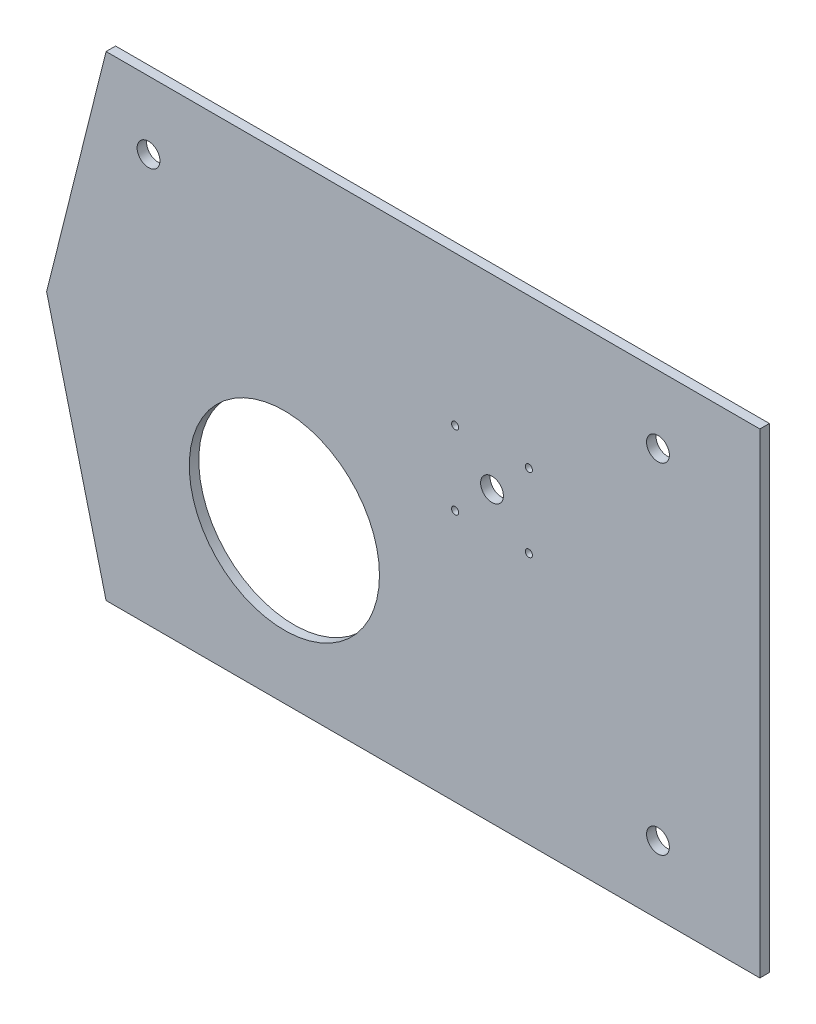
ISO-10303-21;
HEADER;
FILE_DESCRIPTION(('STEP AP214'),'2;1');
FILE_NAME('part.step','',(''),(''),'','','');
FILE_SCHEMA(('AUTOMOTIVE_DESIGN { 1 0 10303 214 1 1 1 1 }'));
ENDSEC;
DATA;
#1=APPLICATION_CONTEXT('core data for automotive mechanical design processes');
#2=APPLICATION_PROTOCOL_DEFINITION('international standard','automotive_design',2000,#1);
#3=PRODUCT_CONTEXT('',#1,'mechanical');
#4=PRODUCT('Part','Part','',(#3));
#5=PRODUCT_RELATED_PRODUCT_CATEGORY('part','',(#4));
#6=PRODUCT_DEFINITION_FORMATION('','',#4);
#7=PRODUCT_DEFINITION_CONTEXT('part definition',#1,'design');
#8=PRODUCT_DEFINITION('design','',#6,#7);
#9=PRODUCT_DEFINITION_SHAPE('','',#8);
#10=(LENGTH_UNIT() NAMED_UNIT(*) SI_UNIT(.MILLI.,.METRE.));
#11=(NAMED_UNIT(*) PLANE_ANGLE_UNIT() SI_UNIT($,.RADIAN.));
#12=(NAMED_UNIT(*) SI_UNIT($,.STERADIAN.) SOLID_ANGLE_UNIT());
#13=UNCERTAINTY_MEASURE_WITH_UNIT(LENGTH_MEASURE(1.E-05),#10,'distance_accuracy_value','');
#14=(GEOMETRIC_REPRESENTATION_CONTEXT(3) GLOBAL_UNCERTAINTY_ASSIGNED_CONTEXT((#13)) GLOBAL_UNIT_ASSIGNED_CONTEXT((#10,
#11,#12)) REPRESENTATION_CONTEXT('',''));
#15=CARTESIAN_POINT('',(0.,0.,0.));
#16=DIRECTION('',(0.,0.,1.));
#17=DIRECTION('',(1.,0.,0.));
#18=AXIS2_PLACEMENT_3D('',#15,#16,#17);
#19=CARTESIAN_POINT('',(-141.176470588235,35.2941176470588,4.));
#20=DIRECTION('',(-0.970142500145332,0.242535625036333,0.));
#21=DIRECTION('',(-0.242535625036333,-0.970142500145332,0.));
#22=AXIS2_PLACEMENT_3D('',#19,#20,#21);
#23=PLANE('',#22);
#24=DIRECTION('',(0.242535625036333,0.970142500145332,0.));
#25=VECTOR('',#24,1.);
#26=CARTESIAN_POINT('',(-141.176470588235,35.2941176470588,0.));
#27=LINE('',#26,#25);
#28=CARTESIAN_POINT('',(-150.,0.,0.));
#29=VERTEX_POINT('',#28);
#30=CARTESIAN_POINT('',(-125.,99.9999999999999,0.));
#31=VERTEX_POINT('',#30);
#32=EDGE_CURVE('E141',#29,#31,#27,.T.);
#33=ORIENTED_EDGE('',*,*,#32,.F.);
#34=DIRECTION('',(0.,0.,-1.));
#35=VECTOR('',#34,1.);
#36=CARTESIAN_POINT('',(-150.,0.,4.));
#37=LINE('',#36,#35);
#38=CARTESIAN_POINT('',(-150.,0.,4.));
#39=VERTEX_POINT('',#38);
#40=EDGE_CURVE('E11',#39,#29,#37,.T.);
#41=ORIENTED_EDGE('',*,*,#40,.F.);
#42=DIRECTION('',(0.242535625036333,0.970142500145332,0.));
#43=VECTOR('',#42,1.);
#44=CARTESIAN_POINT('',(-141.176470588235,35.2941176470588,4.));
#45=LINE('',#44,#43);
#46=CARTESIAN_POINT('',(-125.,99.9999999999999,4.));
#47=VERTEX_POINT('',#46);
#48=EDGE_CURVE('E109',#39,#47,#45,.T.);
#49=ORIENTED_EDGE('',*,*,#48,.T.);
#50=DIRECTION('',(0.,0.,-1.));
#51=VECTOR('',#50,1.);
#52=CARTESIAN_POINT('',(-125.,99.9999999999999,4.));
#53=LINE('',#52,#51);
#54=EDGE_CURVE('E79',#47,#31,#53,.T.);
#55=ORIENTED_EDGE('',*,*,#54,.T.);
#56=EDGE_LOOP('',(#33,#41,#49,#55));
#57=FACE_BOUND('',#56,.T.);
#58=ADVANCED_FACE('F36',(#57),#23,.T.);
#59=CARTESIAN_POINT('',(-141.176470588235,-35.2941176470588,4.));
#60=DIRECTION('',(-0.970142500145332,-0.242535625036333,0.));
#61=DIRECTION('',(0.242535625036333,-0.970142500145332,0.));
#62=AXIS2_PLACEMENT_3D('',#59,#60,#61);
#63=PLANE('',#62);
#64=DIRECTION('',(-0.242535625036333,0.970142500145332,0.));
#65=VECTOR('',#64,1.);
#66=CARTESIAN_POINT('',(-141.176470588235,-35.2941176470588,0.));
#67=LINE('',#66,#65);
#68=CARTESIAN_POINT('',(-125.,-100.,0.));
#69=VERTEX_POINT('',#68);
#70=EDGE_CURVE('E143',#69,#29,#67,.T.);
#71=ORIENTED_EDGE('',*,*,#70,.F.);
#72=DIRECTION('',(0.,0.,-1.));
#73=VECTOR('',#72,1.);
#74=CARTESIAN_POINT('',(-125.,-100.,4.));
#75=LINE('',#74,#73);
#76=CARTESIAN_POINT('',(-125.,-100.,4.));
#77=VERTEX_POINT('',#76);
#78=EDGE_CURVE('E45',#77,#69,#75,.T.);
#79=ORIENTED_EDGE('',*,*,#78,.F.);
#80=DIRECTION('',(-0.242535625036333,0.970142500145332,0.));
#81=VECTOR('',#80,1.);
#82=CARTESIAN_POINT('',(-141.176470588235,-35.2941176470588,4.));
#83=LINE('',#82,#81);
#84=EDGE_CURVE('E107',#77,#39,#83,.T.);
#85=ORIENTED_EDGE('',*,*,#84,.T.);
#86=ORIENTED_EDGE('',*,*,#40,.T.);
#87=EDGE_LOOP('',(#71,#79,#85,#86));
#88=FACE_BOUND('',#87,.T.);
#89=ADVANCED_FACE('F154',(#88),#63,.T.);
#90=CARTESIAN_POINT('',(0.,-100.,4.));
#91=DIRECTION('',(0.,-1.,0.));
#92=DIRECTION('',(1.,0.,0.));
#93=AXIS2_PLACEMENT_3D('',#90,#91,#92);
#94=PLANE('',#93);
#95=DIRECTION('',(-1.,0.,0.));
#96=VECTOR('',#95,1.);
#97=CARTESIAN_POINT('',(0.,-100.,0.));
#98=LINE('',#97,#96);
#99=CARTESIAN_POINT('',(150.,-99.9999999999999,0.));
#100=VERTEX_POINT('',#99);
#101=EDGE_CURVE('E95',#100,#69,#98,.T.);
#102=ORIENTED_EDGE('',*,*,#101,.F.);
#103=DIRECTION('',(0.,0.,-1.));
#104=VECTOR('',#103,1.);
#105=CARTESIAN_POINT('',(150.,-99.9999999999999,4.));
#106=LINE('',#105,#104);
#107=CARTESIAN_POINT('',(150.,-99.9999999999999,4.));
#108=VERTEX_POINT('',#107);
#109=EDGE_CURVE('E89',#108,#100,#106,.T.);
#110=ORIENTED_EDGE('',*,*,#109,.F.);
#111=DIRECTION('',(-1.,0.,0.));
#112=VECTOR('',#111,1.);
#113=CARTESIAN_POINT('',(0.,-100.,4.));
#114=LINE('',#113,#112);
#115=EDGE_CURVE('E93',#108,#77,#114,.T.);
#116=ORIENTED_EDGE('',*,*,#115,.T.);
#117=ORIENTED_EDGE('',*,*,#78,.T.);
#118=EDGE_LOOP('',(#102,#110,#116,#117));
#119=FACE_BOUND('',#118,.T.);
#120=ADVANCED_FACE('F91',(#119),#94,.T.);
#121=CARTESIAN_POINT('',(150.,0.,4.));
#122=DIRECTION('',(-1.,0.,0.));
#123=DIRECTION('',(0.,-1.,0.));
#124=AXIS2_PLACEMENT_3D('',#121,#122,#123);
#125=PLANE('',#124);
#126=DIRECTION('',(0.,1.,0.));
#127=VECTOR('',#126,1.);
#128=CARTESIAN_POINT('',(150.,0.,0.));
#129=LINE('',#128,#127);
#130=CARTESIAN_POINT('',(150.,100.,0.));
#131=VERTEX_POINT('',#130);
#132=EDGE_CURVE('E147',#100,#131,#129,.T.);
#133=ORIENTED_EDGE('',*,*,#132,.T.);
#134=DIRECTION('',(0.,0.,-1.));
#135=VECTOR('',#134,1.);
#136=CARTESIAN_POINT('',(150.,100.,4.));
#137=LINE('',#136,#135);
#138=CARTESIAN_POINT('',(150.,100.,4.));
#139=VERTEX_POINT('',#138);
#140=EDGE_CURVE('E98',#139,#131,#137,.T.);
#141=ORIENTED_EDGE('',*,*,#140,.F.);
#142=DIRECTION('',(0.,1.,0.));
#143=VECTOR('',#142,1.);
#144=CARTESIAN_POINT('',(150.,0.,4.));
#145=LINE('',#144,#143);
#146=EDGE_CURVE('E101',#108,#139,#145,.T.);
#147=ORIENTED_EDGE('',*,*,#146,.F.);
#148=ORIENTED_EDGE('',*,*,#109,.T.);
#149=EDGE_LOOP('',(#133,#141,#147,#148));
#150=FACE_BOUND('',#149,.T.);
#151=ADVANCED_FACE('F102',(#150),#125,.F.);
#152=CARTESIAN_POINT('',(21.832408691632,37.1520265063954,4.));
#153=DIRECTION('',(0.,0.,-1.));
#154=DIRECTION('',(-1.,0.,0.));
#155=AXIS2_PLACEMENT_3D('',#152,#153,#154);
#156=CYLINDRICAL_SURFACE('',#155,1.5);
#157=CARTESIAN_POINT('',(21.832408691632,37.1520265063954,4.));
#158=DIRECTION('',(0.,0.,1.));
#159=DIRECTION('',(1.,0.,0.));
#160=AXIS2_PLACEMENT_3D('',#157,#158,#159);
#161=CIRCLE('',#160,1.5);
#162=CARTESIAN_POINT('',(23.332408691632,37.1520265063954,4.));
#163=VERTEX_POINT('',#162);
#164=EDGE_CURVE('E258',#163,#163,#161,.T.);
#165=ORIENTED_EDGE('',*,*,#164,.T.);
#166=EDGE_LOOP('',(#165));
#167=FACE_BOUND('',#166,.T.);
#168=CARTESIAN_POINT('',(21.832408691632,37.1520265063954,0.));
#169=DIRECTION('',(0.,0.,1.));
#170=DIRECTION('',(1.,0.,0.));
#171=AXIS2_PLACEMENT_3D('',#168,#169,#170);
#172=CIRCLE('',#171,1.5);
#173=CARTESIAN_POINT('',(23.332408691632,37.1520265063954,0.));
#174=VERTEX_POINT('',#173);
#175=EDGE_CURVE('E138',#174,#174,#172,.T.);
#176=ORIENTED_EDGE('',*,*,#175,.F.);
#177=EDGE_LOOP('',(#176));
#178=FACE_BOUND('',#177,.T.);
#179=ADVANCED_FACE('F175',(#167,#178),#156,.F.);
#180=CARTESIAN_POINT('',(52.832408691632,37.1520265063954,4.));
#181=DIRECTION('',(0.,0.,-1.));
#182=DIRECTION('',(-1.,0.,0.));
#183=AXIS2_PLACEMENT_3D('',#180,#181,#182);
#184=CYLINDRICAL_SURFACE('',#183,1.50000000000003);
#185=CARTESIAN_POINT('',(52.832408691632,37.1520265063954,4.));
#186=DIRECTION('',(0.,0.,1.));
#187=DIRECTION('',(1.,0.,0.));
#188=AXIS2_PLACEMENT_3D('',#185,#186,#187);
#189=CIRCLE('',#188,1.50000000000003);
#190=CARTESIAN_POINT('',(54.332408691632,37.1520265063954,4.));
#191=VERTEX_POINT('',#190);
#192=EDGE_CURVE('E255',#191,#191,#189,.T.);
#193=ORIENTED_EDGE('',*,*,#192,.T.);
#194=EDGE_LOOP('',(#193));
#195=FACE_BOUND('',#194,.T.);
#196=CARTESIAN_POINT('',(52.832408691632,37.1520265063954,0.));
#197=DIRECTION('',(0.,0.,1.));
#198=DIRECTION('',(1.,0.,0.));
#199=AXIS2_PLACEMENT_3D('',#196,#197,#198);
#200=CIRCLE('',#199,1.50000000000003);
#201=CARTESIAN_POINT('',(54.332408691632,37.1520265063954,0.));
#202=VERTEX_POINT('',#201);
#203=EDGE_CURVE('E135',#202,#202,#200,.T.);
#204=ORIENTED_EDGE('',*,*,#203,.F.);
#205=EDGE_LOOP('',(#204));
#206=FACE_BOUND('',#205,.T.);
#207=ADVANCED_FACE('F178',(#195,#206),#184,.F.);
#208=CARTESIAN_POINT('',(52.832408691632,6.15202650639541,4.));
#209=DIRECTION('',(0.,0.,-1.));
#210=DIRECTION('',(-1.,0.,0.));
#211=AXIS2_PLACEMENT_3D('',#208,#209,#210);
#212=CYLINDRICAL_SURFACE('',#211,1.50000000000003);
#213=CARTESIAN_POINT('',(52.832408691632,6.15202650639541,4.));
#214=DIRECTION('',(0.,0.,1.));
#215=DIRECTION('',(1.,0.,0.));
#216=AXIS2_PLACEMENT_3D('',#213,#214,#215);
#217=CIRCLE('',#216,1.50000000000003);
#218=CARTESIAN_POINT('',(54.332408691632,6.15202650639541,4.));
#219=VERTEX_POINT('',#218);
#220=EDGE_CURVE('E252',#219,#219,#217,.T.);
#221=ORIENTED_EDGE('',*,*,#220,.T.);
#222=EDGE_LOOP('',(#221));
#223=FACE_BOUND('',#222,.T.);
#224=CARTESIAN_POINT('',(52.832408691632,6.15202650639541,0.));
#225=DIRECTION('',(0.,0.,1.));
#226=DIRECTION('',(1.,0.,0.));
#227=AXIS2_PLACEMENT_3D('',#224,#225,#226);
#228=CIRCLE('',#227,1.50000000000003);
#229=CARTESIAN_POINT('',(54.332408691632,6.15202650639541,0.));
#230=VERTEX_POINT('',#229);
#231=EDGE_CURVE('E132',#230,#230,#228,.T.);
#232=ORIENTED_EDGE('',*,*,#231,.F.);
#233=EDGE_LOOP('',(#232));
#234=FACE_BOUND('',#233,.T.);
#235=ADVANCED_FACE('F182',(#223,#234),#212,.F.);
#236=CARTESIAN_POINT('',(21.832408691632,6.15202650639541,4.));
#237=DIRECTION('',(0.,0.,-1.));
#238=DIRECTION('',(-1.,0.,0.));
#239=AXIS2_PLACEMENT_3D('',#236,#237,#238);
#240=CYLINDRICAL_SURFACE('',#239,1.5);
#241=CARTESIAN_POINT('',(21.832408691632,6.15202650639541,4.));
#242=DIRECTION('',(0.,0.,1.));
#243=DIRECTION('',(1.,0.,0.));
#244=AXIS2_PLACEMENT_3D('',#241,#242,#243);
#245=CIRCLE('',#244,1.5);
#246=CARTESIAN_POINT('',(23.332408691632,6.15202650639541,4.));
#247=VERTEX_POINT('',#246);
#248=EDGE_CURVE('E249',#247,#247,#245,.T.);
#249=ORIENTED_EDGE('',*,*,#248,.T.);
#250=EDGE_LOOP('',(#249));
#251=FACE_BOUND('',#250,.T.);
#252=CARTESIAN_POINT('',(21.832408691632,6.15202650639541,0.));
#253=DIRECTION('',(0.,0.,1.));
#254=DIRECTION('',(1.,0.,0.));
#255=AXIS2_PLACEMENT_3D('',#252,#253,#254);
#256=CIRCLE('',#255,1.5);
#257=CARTESIAN_POINT('',(23.332408691632,6.15202650639541,0.));
#258=VERTEX_POINT('',#257);
#259=EDGE_CURVE('E129',#258,#258,#256,.T.);
#260=ORIENTED_EDGE('',*,*,#259,.F.);
#261=EDGE_LOOP('',(#260));
#262=FACE_BOUND('',#261,.T.);
#263=ADVANCED_FACE('F186',(#251,#262),#240,.F.);
#264=CARTESIAN_POINT('',(107.142857142857,71.4285714285714,4.));
#265=DIRECTION('',(0.,0.,-1.));
#266=DIRECTION('',(-1.,0.,0.));
#267=AXIS2_PLACEMENT_3D('',#264,#265,#266);
#268=CYLINDRICAL_SURFACE('',#267,4.8);
#269=CARTESIAN_POINT('',(107.142857142857,71.4285714285714,4.));
#270=DIRECTION('',(0.,0.,1.));
#271=DIRECTION('',(1.,0.,0.));
#272=AXIS2_PLACEMENT_3D('',#269,#270,#271);
#273=CIRCLE('',#272,4.8);
#274=CARTESIAN_POINT('',(111.942857142857,71.4285714285714,4.));
#275=VERTEX_POINT('',#274);
#276=EDGE_CURVE('E246',#275,#275,#273,.T.);
#277=ORIENTED_EDGE('',*,*,#276,.T.);
#278=EDGE_LOOP('',(#277));
#279=FACE_BOUND('',#278,.T.);
#280=CARTESIAN_POINT('',(107.142857142857,71.4285714285714,0.));
#281=DIRECTION('',(0.,0.,1.));
#282=DIRECTION('',(1.,0.,0.));
#283=AXIS2_PLACEMENT_3D('',#280,#281,#282);
#284=CIRCLE('',#283,4.8);
#285=CARTESIAN_POINT('',(111.942857142857,71.4285714285714,0.));
#286=VERTEX_POINT('',#285);
#287=EDGE_CURVE('E126',#286,#286,#284,.T.);
#288=ORIENTED_EDGE('',*,*,#287,.F.);
#289=EDGE_LOOP('',(#288));
#290=FACE_BOUND('',#289,.T.);
#291=ADVANCED_FACE('F190',(#279,#290),#268,.F.);
#292=CARTESIAN_POINT('',(107.142857142857,-71.4285714285714,4.));
#293=DIRECTION('',(0.,0.,-1.));
#294=DIRECTION('',(-1.,0.,0.));
#295=AXIS2_PLACEMENT_3D('',#292,#293,#294);
#296=CYLINDRICAL_SURFACE('',#295,4.8);
#297=CARTESIAN_POINT('',(107.142857142857,-71.4285714285714,4.));
#298=DIRECTION('',(0.,0.,1.));
#299=DIRECTION('',(1.,0.,0.));
#300=AXIS2_PLACEMENT_3D('',#297,#298,#299);
#301=CIRCLE('',#300,4.8);
#302=CARTESIAN_POINT('',(111.942857142857,-71.4285714285714,4.));
#303=VERTEX_POINT('',#302);
#304=EDGE_CURVE('E239',#303,#303,#301,.T.);
#305=ORIENTED_EDGE('',*,*,#304,.T.);
#306=EDGE_LOOP('',(#305));
#307=FACE_BOUND('',#306,.T.);
#308=CARTESIAN_POINT('',(107.142857142857,-71.4285714285714,0.));
#309=DIRECTION('',(0.,0.,1.));
#310=DIRECTION('',(1.,0.,0.));
#311=AXIS2_PLACEMENT_3D('',#308,#309,#310);
#312=CIRCLE('',#311,4.8);
#313=CARTESIAN_POINT('',(111.942857142857,-71.4285714285714,0.));
#314=VERTEX_POINT('',#313);
#315=EDGE_CURVE('E123',#314,#314,#312,.T.);
#316=ORIENTED_EDGE('',*,*,#315,.F.);
#317=EDGE_LOOP('',(#316));
#318=FACE_BOUND('',#317,.T.);
#319=ADVANCED_FACE('F194',(#307,#318),#296,.F.);
#320=CARTESIAN_POINT('',(37.332408691632,21.6520265063954,4.));
#321=DIRECTION('',(0.,0.,-1.));
#322=DIRECTION('',(-1.,0.,0.));
#323=AXIS2_PLACEMENT_3D('',#320,#321,#322);
#324=CYLINDRICAL_SURFACE('',#323,4.8);
#325=CARTESIAN_POINT('',(37.332408691632,21.6520265063954,4.));
#326=DIRECTION('',(0.,0.,1.));
#327=DIRECTION('',(1.,0.,0.));
#328=AXIS2_PLACEMENT_3D('',#325,#326,#327);
#329=CIRCLE('',#328,4.8);
#330=CARTESIAN_POINT('',(42.132408691632,21.6520265063954,4.));
#331=VERTEX_POINT('',#330);
#332=EDGE_CURVE('E236',#331,#331,#329,.T.);
#333=ORIENTED_EDGE('',*,*,#332,.T.);
#334=EDGE_LOOP('',(#333));
#335=FACE_BOUND('',#334,.T.);
#336=CARTESIAN_POINT('',(37.332408691632,21.6520265063954,0.));
#337=DIRECTION('',(0.,0.,1.));
#338=DIRECTION('',(1.,0.,0.));
#339=AXIS2_PLACEMENT_3D('',#336,#337,#338);
#340=CIRCLE('',#339,4.8);
#341=CARTESIAN_POINT('',(42.132408691632,21.6520265063954,0.));
#342=VERTEX_POINT('',#341);
#343=EDGE_CURVE('E120',#342,#342,#340,.T.);
#344=ORIENTED_EDGE('',*,*,#343,.F.);
#345=EDGE_LOOP('',(#344));
#346=FACE_BOUND('',#345,.T.);
#347=ADVANCED_FACE('F198',(#335,#346),#324,.F.);
#348=CARTESIAN_POINT('',(-50.,-33.3333333333334,4.));
#349=DIRECTION('',(0.,0.,-1.));
#350=DIRECTION('',(-1.,0.,0.));
#351=AXIS2_PLACEMENT_3D('',#348,#349,#350);
#352=CYLINDRICAL_SURFACE('',#351,40.);
#353=CARTESIAN_POINT('',(-50.,-33.3333333333334,4.));
#354=DIRECTION('',(0.,0.,1.));
#355=DIRECTION('',(1.,0.,0.));
#356=AXIS2_PLACEMENT_3D('',#353,#354,#355);
#357=CIRCLE('',#356,40.);
#358=CARTESIAN_POINT('',(-9.99999999999997,-33.3333333333334,4.));
#359=VERTEX_POINT('',#358);
#360=EDGE_CURVE('E212',#359,#359,#357,.T.);
#361=ORIENTED_EDGE('',*,*,#360,.T.);
#362=EDGE_LOOP('',(#361));
#363=FACE_BOUND('',#362,.T.);
#364=CARTESIAN_POINT('',(-50.,-33.3333333333334,0.));
#365=DIRECTION('',(0.,0.,1.));
#366=DIRECTION('',(1.,0.,0.));
#367=AXIS2_PLACEMENT_3D('',#364,#365,#366);
#368=CIRCLE('',#367,40.);
#369=CARTESIAN_POINT('',(-9.99999999999997,-33.3333333333334,0.));
#370=VERTEX_POINT('',#369);
#371=EDGE_CURVE('E117',#370,#370,#368,.T.);
#372=ORIENTED_EDGE('',*,*,#371,.F.);
#373=EDGE_LOOP('',(#372));
#374=FACE_BOUND('',#373,.T.);
#375=ADVANCED_FACE('F201',(#363,#374),#352,.F.);
#376=CARTESIAN_POINT('',(-107.142857142857,71.4285714285713,4.));
#377=DIRECTION('',(0.,0.,-1.));
#378=DIRECTION('',(-1.,0.,0.));
#379=AXIS2_PLACEMENT_3D('',#376,#377,#378);
#380=CYLINDRICAL_SURFACE('',#379,4.8);
#381=CARTESIAN_POINT('',(-107.142857142857,71.4285714285713,4.));
#382=DIRECTION('',(0.,0.,1.));
#383=DIRECTION('',(1.,0.,0.));
#384=AXIS2_PLACEMENT_3D('',#381,#382,#383);
#385=CIRCLE('',#384,4.8);
#386=CARTESIAN_POINT('',(-102.342857142857,71.4285714285713,4.));
#387=VERTEX_POINT('',#386);
#388=EDGE_CURVE('E150',#387,#387,#385,.T.);
#389=ORIENTED_EDGE('',*,*,#388,.T.);
#390=EDGE_LOOP('',(#389));
#391=FACE_BOUND('',#390,.T.);
#392=CARTESIAN_POINT('',(-107.142857142857,71.4285714285713,0.));
#393=DIRECTION('',(0.,0.,1.));
#394=DIRECTION('',(1.,0.,0.));
#395=AXIS2_PLACEMENT_3D('',#392,#393,#394);
#396=CIRCLE('',#395,4.8);
#397=CARTESIAN_POINT('',(-102.342857142857,71.4285714285713,0.));
#398=VERTEX_POINT('',#397);
#399=EDGE_CURVE('E114',#398,#398,#396,.T.);
#400=ORIENTED_EDGE('',*,*,#399,.F.);
#401=EDGE_LOOP('',(#400));
#402=FACE_BOUND('',#401,.T.);
#403=ADVANCED_FACE('F38',(#391,#402),#380,.F.);
#404=CARTESIAN_POINT('',(0.,100.,4.));
#405=DIRECTION('',(0.,-1.,0.));
#406=DIRECTION('',(1.,0.,0.));
#407=AXIS2_PLACEMENT_3D('',#404,#405,#406);
#408=PLANE('',#407);
#409=DIRECTION('',(-1.,0.,0.));
#410=VECTOR('',#409,1.);
#411=CARTESIAN_POINT('',(0.,100.,0.));
#412=LINE('',#411,#410);
#413=EDGE_CURVE('E72',#131,#31,#412,.T.);
#414=ORIENTED_EDGE('',*,*,#413,.T.);
#415=ORIENTED_EDGE('',*,*,#54,.F.);
#416=DIRECTION('',(-1.,0.,0.));
#417=VECTOR('',#416,1.);
#418=CARTESIAN_POINT('',(0.,100.,4.));
#419=LINE('',#418,#417);
#420=EDGE_CURVE('E53',#139,#47,#419,.T.);
#421=ORIENTED_EDGE('',*,*,#420,.F.);
#422=ORIENTED_EDGE('',*,*,#140,.T.);
#423=EDGE_LOOP('',(#414,#415,#421,#422));
#424=FACE_BOUND('',#423,.T.);
#425=ADVANCED_FACE('F162',(#424),#408,.F.);
#426=CARTESIAN_POINT('',(0.,0.,4.));
#427=DIRECTION('',(0.,0.,1.));
#428=DIRECTION('',(1.,0.,0.));
#429=AXIS2_PLACEMENT_3D('',#426,#427,#428);
#430=PLANE('',#429);
#431=ORIENTED_EDGE('',*,*,#388,.F.);
#432=EDGE_LOOP('',(#431));
#433=FACE_BOUND('',#432,.T.);
#434=ORIENTED_EDGE('',*,*,#360,.F.);
#435=EDGE_LOOP('',(#434));
#436=FACE_BOUND('',#435,.T.);
#437=ORIENTED_EDGE('',*,*,#332,.F.);
#438=EDGE_LOOP('',(#437));
#439=FACE_BOUND('',#438,.T.);
#440=ORIENTED_EDGE('',*,*,#304,.F.);
#441=EDGE_LOOP('',(#440));
#442=FACE_BOUND('',#441,.T.);
#443=ORIENTED_EDGE('',*,*,#276,.F.);
#444=EDGE_LOOP('',(#443));
#445=FACE_BOUND('',#444,.T.);
#446=ORIENTED_EDGE('',*,*,#248,.F.);
#447=EDGE_LOOP('',(#446));
#448=FACE_BOUND('',#447,.T.);
#449=ORIENTED_EDGE('',*,*,#220,.F.);
#450=EDGE_LOOP('',(#449));
#451=FACE_BOUND('',#450,.T.);
#452=ORIENTED_EDGE('',*,*,#192,.F.);
#453=EDGE_LOOP('',(#452));
#454=FACE_BOUND('',#453,.T.);
#455=ORIENTED_EDGE('',*,*,#164,.F.);
#456=EDGE_LOOP('',(#455));
#457=FACE_BOUND('',#456,.T.);
#458=ORIENTED_EDGE('',*,*,#48,.F.);
#459=ORIENTED_EDGE('',*,*,#84,.F.);
#460=ORIENTED_EDGE('',*,*,#115,.F.);
#461=ORIENTED_EDGE('',*,*,#146,.T.);
#462=ORIENTED_EDGE('',*,*,#420,.T.);
#463=EDGE_LOOP('',(#458,#459,#460,#461,#462));
#464=FACE_BOUND('',#463,.T.);
#465=ADVANCED_FACE('F105',(#433,#436,#439,#442,#445,#448,#451,#454,#457,#464),#430,.T.);
#466=CARTESIAN_POINT('',(0.,0.,0.));
#467=DIRECTION('',(0.,0.,1.));
#468=DIRECTION('',(1.,0.,0.));
#469=AXIS2_PLACEMENT_3D('',#466,#467,#468);
#470=PLANE('',#469);
#471=ORIENTED_EDGE('',*,*,#399,.T.);
#472=EDGE_LOOP('',(#471));
#473=FACE_BOUND('',#472,.T.);
#474=ORIENTED_EDGE('',*,*,#371,.T.);
#475=EDGE_LOOP('',(#474));
#476=FACE_BOUND('',#475,.T.);
#477=ORIENTED_EDGE('',*,*,#343,.T.);
#478=EDGE_LOOP('',(#477));
#479=FACE_BOUND('',#478,.T.);
#480=ORIENTED_EDGE('',*,*,#315,.T.);
#481=EDGE_LOOP('',(#480));
#482=FACE_BOUND('',#481,.T.);
#483=ORIENTED_EDGE('',*,*,#287,.T.);
#484=EDGE_LOOP('',(#483));
#485=FACE_BOUND('',#484,.T.);
#486=ORIENTED_EDGE('',*,*,#259,.T.);
#487=EDGE_LOOP('',(#486));
#488=FACE_BOUND('',#487,.T.);
#489=ORIENTED_EDGE('',*,*,#231,.T.);
#490=EDGE_LOOP('',(#489));
#491=FACE_BOUND('',#490,.T.);
#492=ORIENTED_EDGE('',*,*,#203,.T.);
#493=EDGE_LOOP('',(#492));
#494=FACE_BOUND('',#493,.T.);
#495=ORIENTED_EDGE('',*,*,#175,.T.);
#496=EDGE_LOOP('',(#495));
#497=FACE_BOUND('',#496,.T.);
#498=ORIENTED_EDGE('',*,*,#32,.T.);
#499=ORIENTED_EDGE('',*,*,#413,.F.);
#500=ORIENTED_EDGE('',*,*,#132,.F.);
#501=ORIENTED_EDGE('',*,*,#101,.T.);
#502=ORIENTED_EDGE('',*,*,#70,.T.);
#503=EDGE_LOOP('',(#498,#499,#500,#501,#502));
#504=FACE_BOUND('',#503,.T.);
#505=ADVANCED_FACE('F155',(#473,#476,#479,#482,#485,#488,#491,#494,#497,#504),#470,.F.);
#506=CLOSED_SHELL('',(#58,#89,#120,#151,#179,#207,#235,#263,#291,#319,#347,#375,#403,#425,#465,#505));
#507=MANIFOLD_SOLID_BREP('B2',#506);
#508=ADVANCED_BREP_SHAPE_REPRESENTATION('',(#18,#507),#14);
#509=SHAPE_DEFINITION_REPRESENTATION(#9,#508);
ENDSEC;
END-ISO-10303-21;
